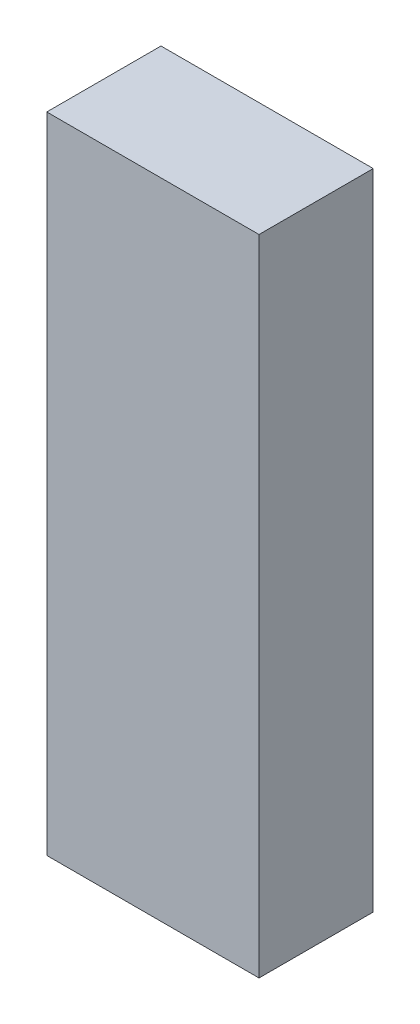
ISO-10303-21;
HEADER;
FILE_DESCRIPTION(('STEP AP214'),'2;1');
FILE_NAME('part.step','',(''),(''),'','','');
FILE_SCHEMA(('AUTOMOTIVE_DESIGN { 1 0 10303 214 1 1 1 1 }'));
ENDSEC;
DATA;
#1=APPLICATION_CONTEXT('core data for automotive mechanical design processes');
#2=APPLICATION_PROTOCOL_DEFINITION('international standard','automotive_design',2000,#1);
#3=PRODUCT_CONTEXT('',#1,'mechanical');
#4=PRODUCT('Part','Part','',(#3));
#5=PRODUCT_RELATED_PRODUCT_CATEGORY('part','',(#4));
#6=PRODUCT_DEFINITION_FORMATION('','',#4);
#7=PRODUCT_DEFINITION_CONTEXT('part definition',#1,'design');
#8=PRODUCT_DEFINITION('design','',#6,#7);
#9=PRODUCT_DEFINITION_SHAPE('','',#8);
#10=(LENGTH_UNIT() NAMED_UNIT(*) SI_UNIT(.MILLI.,.METRE.));
#11=(NAMED_UNIT(*) PLANE_ANGLE_UNIT() SI_UNIT($,.RADIAN.));
#12=(NAMED_UNIT(*) SI_UNIT($,.STERADIAN.) SOLID_ANGLE_UNIT());
#13=UNCERTAINTY_MEASURE_WITH_UNIT(LENGTH_MEASURE(1.E-05),#10,'distance_accuracy_value','');
#14=(GEOMETRIC_REPRESENTATION_CONTEXT(3) GLOBAL_UNCERTAINTY_ASSIGNED_CONTEXT((#13)) GLOBAL_UNIT_ASSIGNED_CONTEXT((#10,
#11,#12)) REPRESENTATION_CONTEXT('',''));
#15=CARTESIAN_POINT('',(0.,0.,0.));
#16=DIRECTION('',(0.,0.,1.));
#17=DIRECTION('',(1.,0.,0.));
#18=AXIS2_PLACEMENT_3D('',#15,#16,#17);
#19=CARTESIAN_POINT('',(0.,51.,0.));
#20=DIRECTION('',(0.,-1.,0.));
#21=DIRECTION('',(0.,0.,-1.));
#22=AXIS2_PLACEMENT_3D('',#19,#20,#21);
#23=CYLINDRICAL_SURFACE('',#22,7.);
#24=CARTESIAN_POINT('',(0.,0.,0.));
#25=DIRECTION('',(0.,-1.,0.));
#26=DIRECTION('',(0.,0.,1.));
#27=AXIS2_PLACEMENT_3D('',#24,#25,#26);
#28=CIRCLE('',#27,7.);
#29=CARTESIAN_POINT('',(6.8601181919575,0.,-1.39240022708048));
#30=VERTEX_POINT('',#29);
#31=CARTESIAN_POINT('',(-6.8601181919575,0.,-1.39240022708048));
#32=VERTEX_POINT('',#31);
#33=EDGE_CURVE('E127',#30,#32,#28,.T.);
#34=ORIENTED_EDGE('',*,*,#33,.T.);
#35=DIRECTION('',(0.,-1.,0.));
#36=VECTOR('',#35,1.);
#37=CARTESIAN_POINT('',(-6.8601181919575,51.,-1.39240022708048));
#38=LINE('',#37,#36);
#39=CARTESIAN_POINT('',(-6.8601181919575,51.,-1.39240022708048));
#40=VERTEX_POINT('',#39);
#41=EDGE_CURVE('E11',#40,#32,#38,.T.);
#42=ORIENTED_EDGE('',*,*,#41,.F.);
#43=CARTESIAN_POINT('',(0.,51.,0.));
#44=DIRECTION('',(0.,-1.,0.));
#45=DIRECTION('',(0.,0.,1.));
#46=AXIS2_PLACEMENT_3D('',#43,#44,#45);
#47=CIRCLE('',#46,7.);
#48=CARTESIAN_POINT('',(6.8601181919575,51.,-1.39240022708048));
#49=VERTEX_POINT('',#48);
#50=EDGE_CURVE('E129',#49,#40,#47,.T.);
#51=ORIENTED_EDGE('',*,*,#50,.F.);
#52=DIRECTION('',(0.,-1.,0.));
#53=VECTOR('',#52,1.);
#54=CARTESIAN_POINT('',(6.8601181919575,51.,-1.39240022708048));
#55=LINE('',#54,#53);
#56=EDGE_CURVE('E53',#49,#30,#55,.T.);
#57=ORIENTED_EDGE('',*,*,#56,.T.);
#58=EDGE_LOOP('',(#34,#42,#51,#57));
#59=FACE_BOUND('',#58,.T.);
#60=ADVANCED_FACE('F39',(#59),#23,.F.);
#61=CARTESIAN_POINT('',(-8.86750477584054,51.,-1.39240022708048));
#62=DIRECTION('',(1.,0.,0.));
#63=DIRECTION('',(0.,0.,-1.));
#64=AXIS2_PLACEMENT_3D('',#61,#62,#63);
#65=PLANE('',#64);
#66=DIRECTION('',(0.,-1.,0.));
#67=VECTOR('',#66,1.);
#68=CARTESIAN_POINT('',(-8.86750477584054,51.,-1.39240022708048));
#69=LINE('',#68,#67);
#70=CARTESIAN_POINT('',(-8.86750477584054,52.4,-1.39240022708048));
#71=VERTEX_POINT('',#70);
#72=CARTESIAN_POINT('',(-8.86750477584054,-1.4,-1.39240022708048));
#73=VERTEX_POINT('',#72);
#74=EDGE_CURVE('E47',#71,#73,#69,.T.);
#75=ORIENTED_EDGE('',*,*,#74,.T.);
#76=DIRECTION('',(0.,0.,-1.));
#77=VECTOR('',#76,1.);
#78=CARTESIAN_POINT('',(-8.86750477584054,-1.4,-1.39240022708048));
#79=LINE('',#78,#77);
#80=CARTESIAN_POINT('',(-8.86750477584054,-1.4,8.15128323625343));
#81=VERTEX_POINT('',#80);
#82=EDGE_CURVE('E118',#81,#73,#79,.T.);
#83=ORIENTED_EDGE('',*,*,#82,.F.);
#84=DIRECTION('',(0.,-1.,0.));
#85=VECTOR('',#84,1.);
#86=CARTESIAN_POINT('',(-8.86750477584054,51.,8.15128323625343));
#87=LINE('',#86,#85);
#88=CARTESIAN_POINT('',(-8.86750477584054,52.4,8.15128323625343));
#89=VERTEX_POINT('',#88);
#90=EDGE_CURVE('E98',#89,#81,#87,.T.);
#91=ORIENTED_EDGE('',*,*,#90,.F.);
#92=DIRECTION('',(0.,0.,1.));
#93=VECTOR('',#92,1.);
#94=CARTESIAN_POINT('',(-8.86750477584054,52.4,0.));
#95=LINE('',#94,#93);
#96=EDGE_CURVE('E100',#71,#89,#95,.T.);
#97=ORIENTED_EDGE('',*,*,#96,.F.);
#98=EDGE_LOOP('',(#75,#83,#91,#97));
#99=FACE_BOUND('',#98,.T.);
#100=ADVANCED_FACE('F101',(#99),#65,.F.);
#101=CARTESIAN_POINT('',(-8.86750477584054,51.,8.15128323625343));
#102=DIRECTION('',(0.,0.,-1.));
#103=DIRECTION('',(-1.,0.,0.));
#104=AXIS2_PLACEMENT_3D('',#101,#102,#103);
#105=PLANE('',#104);
#106=ORIENTED_EDGE('',*,*,#90,.T.);
#107=DIRECTION('',(-1.,0.,0.));
#108=VECTOR('',#107,1.);
#109=CARTESIAN_POINT('',(-8.86750477584054,-1.4,8.15128323625343));
#110=LINE('',#109,#108);
#111=CARTESIAN_POINT('',(8.86750477584054,-1.4,8.15128323625343));
#112=VERTEX_POINT('',#111);
#113=EDGE_CURVE('E124',#112,#81,#110,.T.);
#114=ORIENTED_EDGE('',*,*,#113,.F.);
#115=DIRECTION('',(0.,-1.,0.));
#116=VECTOR('',#115,1.);
#117=CARTESIAN_POINT('',(8.86750477584054,51.,8.15128323625343));
#118=LINE('',#117,#116);
#119=CARTESIAN_POINT('',(8.86750477584054,52.4,8.15128323625343));
#120=VERTEX_POINT('',#119);
#121=EDGE_CURVE('E137',#120,#112,#118,.T.);
#122=ORIENTED_EDGE('',*,*,#121,.F.);
#123=DIRECTION('',(1.,0.,0.));
#124=VECTOR('',#123,1.);
#125=CARTESIAN_POINT('',(0.,52.4,8.15128323625343));
#126=LINE('',#125,#124);
#127=EDGE_CURVE('E105',#89,#120,#126,.T.);
#128=ORIENTED_EDGE('',*,*,#127,.F.);
#129=EDGE_LOOP('',(#106,#114,#122,#128));
#130=FACE_BOUND('',#129,.T.);
#131=ADVANCED_FACE('F141',(#130),#105,.F.);
#132=CARTESIAN_POINT('',(8.86750477584054,51.,-1.39240022708048));
#133=DIRECTION('',(-1.,0.,0.));
#134=DIRECTION('',(0.,0.,1.));
#135=AXIS2_PLACEMENT_3D('',#132,#133,#134);
#136=PLANE('',#135);
#137=ORIENTED_EDGE('',*,*,#121,.T.);
#138=DIRECTION('',(0.,0.,1.));
#139=VECTOR('',#138,1.);
#140=CARTESIAN_POINT('',(8.86750477584054,-1.4,-1.39240022708048));
#141=LINE('',#140,#139);
#142=CARTESIAN_POINT('',(8.86750477584054,-1.4,-1.39240022708048));
#143=VERTEX_POINT('',#142);
#144=EDGE_CURVE('E121',#143,#112,#141,.T.);
#145=ORIENTED_EDGE('',*,*,#144,.F.);
#146=DIRECTION('',(0.,-1.,0.));
#147=VECTOR('',#146,1.);
#148=CARTESIAN_POINT('',(8.86750477584054,51.,-1.39240022708048));
#149=LINE('',#148,#147);
#150=CARTESIAN_POINT('',(8.86750477584054,52.4,-1.39240022708048));
#151=VERTEX_POINT('',#150);
#152=EDGE_CURVE('E135',#151,#143,#149,.T.);
#153=ORIENTED_EDGE('',*,*,#152,.F.);
#154=DIRECTION('',(0.,0.,-1.));
#155=VECTOR('',#154,1.);
#156=CARTESIAN_POINT('',(8.86750477584054,52.4,0.));
#157=LINE('',#156,#155);
#158=EDGE_CURVE('E110',#120,#151,#157,.T.);
#159=ORIENTED_EDGE('',*,*,#158,.F.);
#160=EDGE_LOOP('',(#137,#145,#153,#159));
#161=FACE_BOUND('',#160,.T.);
#162=ADVANCED_FACE('F146',(#161),#136,.F.);
#163=CARTESIAN_POINT('',(6.8601181919575,51.,-1.39240022708048));
#164=DIRECTION('',(0.,0.,1.));
#165=DIRECTION('',(1.,0.,0.));
#166=AXIS2_PLACEMENT_3D('',#163,#164,#165);
#167=PLANE('',#166);
#168=ORIENTED_EDGE('',*,*,#74,.F.);
#169=DIRECTION('',(-1.,0.,0.));
#170=VECTOR('',#169,1.);
#171=CARTESIAN_POINT('',(0.,52.4,-1.39240022708048));
#172=LINE('',#171,#170);
#173=EDGE_CURVE('E92',#151,#71,#172,.T.);
#174=ORIENTED_EDGE('',*,*,#173,.F.);
#175=ORIENTED_EDGE('',*,*,#152,.T.);
#176=DIRECTION('',(1.,0.,0.));
#177=VECTOR('',#176,1.);
#178=CARTESIAN_POINT('',(-8.86750477584054,-1.4,-1.39240022708048));
#179=LINE('',#178,#177);
#180=EDGE_CURVE('E94',#73,#143,#179,.T.);
#181=ORIENTED_EDGE('',*,*,#180,.F.);
#182=EDGE_LOOP('',(#168,#174,#175,#181));
#183=FACE_BOUND('',#182,.T.);
#184=DIRECTION('',(-1.,0.,0.));
#185=VECTOR('',#184,1.);
#186=CARTESIAN_POINT('',(0.,51.,-1.39240022708048));
#187=LINE('',#186,#185);
#188=EDGE_CURVE('E111',#49,#40,#187,.T.);
#189=ORIENTED_EDGE('',*,*,#188,.T.);
#190=ORIENTED_EDGE('',*,*,#41,.T.);
#191=DIRECTION('',(1.,0.,0.));
#192=VECTOR('',#191,1.);
#193=CARTESIAN_POINT('',(-8.86750477584054,0.,-1.39240022708048));
#194=LINE('',#193,#192);
#195=EDGE_CURVE('E116',#32,#30,#194,.T.);
#196=ORIENTED_EDGE('',*,*,#195,.T.);
#197=ORIENTED_EDGE('',*,*,#56,.F.);
#198=EDGE_LOOP('',(#189,#190,#196,#197));
#199=FACE_BOUND('',#198,.T.);
#200=ADVANCED_FACE('F90',(#183,#199),#167,.F.);
#201=CARTESIAN_POINT('',(0.,0.,0.));
#202=DIRECTION('',(0.,1.,0.));
#203=DIRECTION('',(0.,0.,1.));
#204=AXIS2_PLACEMENT_3D('',#201,#202,#203);
#205=PLANE('',#204);
#206=ORIENTED_EDGE('',*,*,#33,.F.);
#207=ORIENTED_EDGE('',*,*,#195,.F.);
#208=EDGE_LOOP('',(#206,#207));
#209=FACE_BOUND('',#208,.T.);
#210=ADVANCED_FACE('F153',(#209),#205,.T.);
#211=CARTESIAN_POINT('',(0.,-1.4,0.));
#212=DIRECTION('',(0.,1.,0.));
#213=DIRECTION('',(0.,0.,1.));
#214=AXIS2_PLACEMENT_3D('',#211,#212,#213);
#215=PLANE('',#214);
#216=ORIENTED_EDGE('',*,*,#82,.T.);
#217=ORIENTED_EDGE('',*,*,#180,.T.);
#218=ORIENTED_EDGE('',*,*,#144,.T.);
#219=ORIENTED_EDGE('',*,*,#113,.T.);
#220=EDGE_LOOP('',(#216,#217,#218,#219));
#221=FACE_BOUND('',#220,.T.);
#222=ADVANCED_FACE('F143',(#221),#215,.F.);
#223=CARTESIAN_POINT('',(0.,51.,0.));
#224=DIRECTION('',(0.,1.,0.));
#225=DIRECTION('',(0.,0.,1.));
#226=AXIS2_PLACEMENT_3D('',#223,#224,#225);
#227=PLANE('',#226);
#228=ORIENTED_EDGE('',*,*,#188,.F.);
#229=ORIENTED_EDGE('',*,*,#50,.T.);
#230=EDGE_LOOP('',(#228,#229));
#231=FACE_BOUND('',#230,.T.);
#232=ADVANCED_FACE('F165',(#231),#227,.F.);
#233=CARTESIAN_POINT('',(0.,52.4,0.));
#234=DIRECTION('',(0.,1.,0.));
#235=DIRECTION('',(0.,0.,1.));
#236=AXIS2_PLACEMENT_3D('',#233,#234,#235);
#237=PLANE('',#236);
#238=ORIENTED_EDGE('',*,*,#173,.T.);
#239=ORIENTED_EDGE('',*,*,#96,.T.);
#240=ORIENTED_EDGE('',*,*,#127,.T.);
#241=ORIENTED_EDGE('',*,*,#158,.T.);
#242=EDGE_LOOP('',(#238,#239,#240,#241));
#243=FACE_BOUND('',#242,.T.);
#244=ADVANCED_FACE('F108',(#243),#237,.T.);
#245=CLOSED_SHELL('',(#60,#100,#131,#162,#200,#210,#222,#232,#244));
#246=MANIFOLD_SOLID_BREP('B2',#245);
#247=ADVANCED_BREP_SHAPE_REPRESENTATION('',(#18,#246),#14);
#248=SHAPE_DEFINITION_REPRESENTATION(#9,#247);
ENDSEC;
END-ISO-10303-21;
